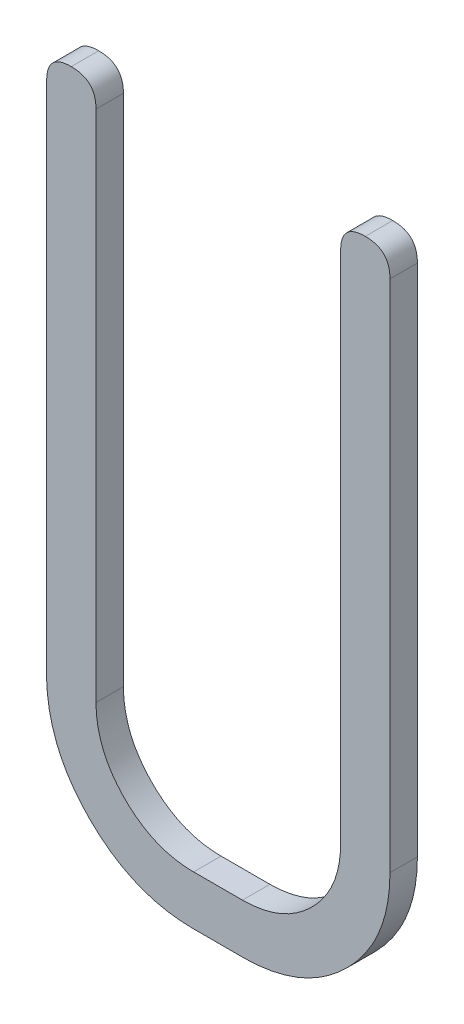
ISO-10303-21;
HEADER;
FILE_DESCRIPTION(('STEP AP214'),'2;1');
FILE_NAME('part.step','',(''),(''),'','','');
FILE_SCHEMA(('AUTOMOTIVE_DESIGN { 1 0 10303 214 1 1 1 1 }'));
ENDSEC;
DATA;
#1=APPLICATION_CONTEXT('core data for automotive mechanical design processes');
#2=APPLICATION_PROTOCOL_DEFINITION('international standard','automotive_design',2000,#1);
#3=PRODUCT_CONTEXT('',#1,'mechanical');
#4=PRODUCT('Part','Part','',(#3));
#5=PRODUCT_RELATED_PRODUCT_CATEGORY('part','',(#4));
#6=PRODUCT_DEFINITION_FORMATION('','',#4);
#7=PRODUCT_DEFINITION_CONTEXT('part definition',#1,'design');
#8=PRODUCT_DEFINITION('design','',#6,#7);
#9=PRODUCT_DEFINITION_SHAPE('','',#8);
#10=(LENGTH_UNIT() NAMED_UNIT(*) SI_UNIT(.MILLI.,.METRE.));
#11=(NAMED_UNIT(*) PLANE_ANGLE_UNIT() SI_UNIT($,.RADIAN.));
#12=(NAMED_UNIT(*) SI_UNIT($,.STERADIAN.) SOLID_ANGLE_UNIT());
#13=UNCERTAINTY_MEASURE_WITH_UNIT(LENGTH_MEASURE(1.E-05),#10,'distance_accuracy_value','');
#14=(GEOMETRIC_REPRESENTATION_CONTEXT(3) GLOBAL_UNCERTAINTY_ASSIGNED_CONTEXT((#13)) GLOBAL_UNIT_ASSIGNED_CONTEXT((#10,
#11,#12)) REPRESENTATION_CONTEXT('',''));
#15=CARTESIAN_POINT('',(0.,0.,0.));
#16=DIRECTION('',(0.,0.,1.));
#17=DIRECTION('',(1.,0.,0.));
#18=AXIS2_PLACEMENT_3D('',#15,#16,#17);
#19=CARTESIAN_POINT('',(0.,0.,1.6));
#20=DIRECTION('',(0.,0.,-1.));
#21=DIRECTION('',(-1.,0.,0.));
#22=AXIS2_PLACEMENT_3D('',#19,#20,#21);
#23=PLANE('',#22);
#24=CARTESIAN_POINT('',(-13.3429437525272,-19.6625547798276,1.6));
#25=CARTESIAN_POINT('',(-13.3429437525272,-19.5733047798276,1.6));
#26=CARTESIAN_POINT('',(-13.2529437525272,-19.5733047798276,1.6));
#27=B_SPLINE_CURVE_WITH_KNOTS('',2,(#24,#25,#26),.UNSPECIFIED.,.F.,.F.,(3,3),(0.,1.),.UNSPECIFIED.);
#28=CARTESIAN_POINT('',(-13.3429437525272,-19.6625547798276,1.6));
#29=VERTEX_POINT('',#28);
#30=CARTESIAN_POINT('',(-13.2529437525272,-19.5733047798276,1.6));
#31=VERTEX_POINT('',#30);
#32=EDGE_CURVE('E175',#29,#31,#27,.T.);
#33=ORIENTED_EDGE('',*,*,#32,.T.);
#34=CARTESIAN_POINT('',(-13.2529437525272,-19.5733047798276,1.6));
#35=CARTESIAN_POINT('',(-13.1629437525272,-19.5733047798276,1.6));
#36=CARTESIAN_POINT('',(-13.1629437525272,-19.6626172798276,1.6));
#37=B_SPLINE_CURVE_WITH_KNOTS('',2,(#34,#35,#36),.UNSPECIFIED.,.F.,.F.,(3,3),(0.,1.),.UNSPECIFIED.);
#38=CARTESIAN_POINT('',(-13.1629437525272,-19.6626172798276,1.6));
#39=VERTEX_POINT('',#38);
#40=EDGE_CURVE('E137',#31,#39,#37,.T.);
#41=ORIENTED_EDGE('',*,*,#40,.T.);
#42=DIRECTION('',(0.,1.,0.));
#43=VECTOR('',#42,1.);
#44=CARTESIAN_POINT('',(-13.1629437525272,-19.6626172798276,1.6));
#45=LINE('',#44,#43);
#46=CARTESIAN_POINT('',(-13.1629437525272,-21.5376172798276,1.6));
#47=VERTEX_POINT('',#46);
#48=EDGE_CURVE('E132',#47,#39,#45,.T.);
#49=ORIENTED_EDGE('',*,*,#48,.F.);
#50=CARTESIAN_POINT('',(-13.1629437525272,-21.5376172798276,1.6));
#51=CARTESIAN_POINT('',(-13.1629398018063,-21.5539345573081,1.6));
#52=CARTESIAN_POINT('',(-13.1635737139581,-21.5702615240957,1.6));
#53=CARTESIAN_POINT('',(-13.1662190725024,-21.6028215898711,1.6));
#54=CARTESIAN_POINT('',(-13.1682321669494,-21.6190545531003,1.6));
#55=CARTESIAN_POINT('',(-13.1737163695039,-21.6511459772082,1.6));
#56=CARTESIAN_POINT('',(-13.1771757946783,-21.6670063866334,1.6));
#57=CARTESIAN_POINT('',(-13.185588337284,-21.6983122727357,1.6));
#58=CARTESIAN_POINT('',(-13.190540767304,-21.7137579368137,1.6));
#59=CARTESIAN_POINT('',(-13.2077514452743,-21.7594768640935,1.6));
#60=CARTESIAN_POINT('',(-13.222329270436,-21.7889255370711,1.6));
#61=CARTESIAN_POINT('',(-13.2481963322795,-21.83055163987,1.6));
#62=CARTESIAN_POINT('',(-13.2575034367635,-21.844021936246,1.6));
#63=CARTESIAN_POINT('',(-13.2773030248523,-21.8700712672825,1.6));
#64=CARTESIAN_POINT('',(-13.2877956968858,-21.8826501597489,1.6));
#65=CARTESIAN_POINT('',(-13.3085736204856,-21.9055470264418,1.6));
#66=CARTESIAN_POINT('',(-13.3187537395851,-21.915961256857,1.6));
#67=CARTESIAN_POINT('',(-13.339820170662,-21.9360415929991,1.6));
#68=CARTESIAN_POINT('',(-13.3507063509913,-21.9457078374581,1.6));
#69=CARTESIAN_POINT('',(-13.3844100604015,-21.9733653645849,1.6));
#70=CARTESIAN_POINT('',(-13.4083196962675,-21.9900680006095,1.6));
#71=CARTESIAN_POINT('',(-13.4610492880886,-22.0205098204532,1.6));
#72=CARTESIAN_POINT('',(-13.4901198346769,-22.0338184607467,1.6));
#73=CARTESIAN_POINT('',(-13.550287979984,-22.0546449723789,1.6));
#74=CARTESIAN_POINT('',(-13.5813868697126,-22.0621591158178,1.6));
#75=CARTESIAN_POINT('',(-13.6273801460908,-22.0690967939304,1.6));
#76=CARTESIAN_POINT('',(-13.641988216102,-22.0706981530884,1.6));
#77=CARTESIAN_POINT('',(-13.6712323131673,-22.0727998214802,1.6));
#78=CARTESIAN_POINT('',(-13.6858680568621,-22.0733040193726,1.6));
#79=CARTESIAN_POINT('',(-13.7005062525272,-22.0733047798276,1.6));
#80=B_SPLINE_CURVE_WITH_KNOTS('',3,(#50,#51,#52,#53,#54,#55,#56,#57,#58,#59,#60,#61,#62,#63,#64,
#65,#66,#67,#68,#69,#70,#71,#72,#73,#74,#75,#76,#77,#78,#79),.UNSPECIFIED.,.F.,.F.,(4,2,2,2,2,2,
2,2,2,2,2,2,2,2,4),(0.,0.0489534661521451,0.0979655315378866,0.14658911902647,0.195190353279846,
0.293010130352061,0.342076568756885,0.391150816559739,0.434803887680262,0.478448842766931,
0.565529470871683,0.660858252620425,0.7562483132609,0.80030220821932,0.844199707301668),.UNSPECIFIED.);
#81=CARTESIAN_POINT('',(-13.7005062525272,-22.0733047798276,1.6));
#82=VERTEX_POINT('',#81);
#83=EDGE_CURVE('E23',#47,#82,#80,.T.);
#84=ORIENTED_EDGE('',*,*,#83,.T.);
#85=DIRECTION('',(1.,0.,0.));
#86=VECTOR('',#85,1.);
#87=CARTESIAN_POINT('',(-13.7005062525272,-22.0733047798276,1.6));
#88=LINE('',#87,#86);
#89=CARTESIAN_POINT('',(-13.8791312525272,-22.0733047798276,1.6));
#90=VERTEX_POINT('',#89);
#91=EDGE_CURVE('E130',#90,#82,#88,.T.);
#92=ORIENTED_EDGE('',*,*,#91,.F.);
#93=CARTESIAN_POINT('',(-13.8791312525272,-22.0733047798276,1.6));
#94=CARTESIAN_POINT('',(-13.8952564736014,-22.0733089573908,1.6));
#95=CARTESIAN_POINT('',(-13.9113907684639,-22.0726801795492,1.6));
#96=CARTESIAN_POINT('',(-13.9435647026714,-22.0700622239027,1.6));
#97=CARTESIAN_POINT('',(-13.9596042208875,-22.0680715767394,1.6));
#98=CARTESIAN_POINT('',(-13.9913067829568,-22.0626577949026,1.6));
#99=CARTESIAN_POINT('',(-14.0069718567041,-22.0592468234264,1.6));
#100=CARTESIAN_POINT('',(-14.0378977029642,-22.0509630462682,1.6));
#101=CARTESIAN_POINT('',(-14.0531586443354,-22.0460908619571,1.6));
#102=CARTESIAN_POINT('',(-14.0983273880169,-22.0291874019806,1.6));
#103=CARTESIAN_POINT('',(-14.127436368046,-22.0148996210445,1.6));
#104=CARTESIAN_POINT('',(-14.168660491291,-21.9895823250857,1.6));
#105=CARTESIAN_POINT('',(-14.1820159394143,-21.9804768038947,1.6));
#106=CARTESIAN_POINT('',(-14.2078733422636,-21.9611135078422,1.6));
#107=CARTESIAN_POINT('',(-14.220375164043,-21.9508555541521,1.6));
#108=CARTESIAN_POINT('',(-14.243361244532,-21.9303662115052,1.6));
#109=CARTESIAN_POINT('',(-14.2539246974858,-21.9202229108959,1.6));
#110=CARTESIAN_POINT('',(-14.2743141870391,-21.8992268726827,1.6));
#111=CARTESIAN_POINT('',(-14.2841403353045,-21.8883742429756,1.6));
#112=CARTESIAN_POINT('',(-14.3122920300438,-21.8547600588256,1.6));
#113=CARTESIAN_POINT('',(-14.329343491761,-21.830895999864,1.6));
#114=CARTESIAN_POINT('',(-14.360592752259,-21.7780336799741,1.6));
#115=CARTESIAN_POINT('',(-14.3743301106466,-21.748760389499,1.6));
#116=CARTESIAN_POINT('',(-14.3958292289554,-21.6880763611869,1.6));
#117=CARTESIAN_POINT('',(-14.4035884796525,-21.656664731827,1.6));
#118=CARTESIAN_POINT('',(-14.4106818449281,-21.6104096655832,1.6));
#119=CARTESIAN_POINT('',(-14.4123029574493,-21.595871606112,1.6));
#120=CARTESIAN_POINT('',(-14.4144316493107,-21.5667622012025,1.6));
#121=CARTESIAN_POINT('',(-14.4149429518961,-21.552191131743,1.6));
#122=CARTESIAN_POINT('',(-14.4149437525272,-21.5376172798276,1.6));
#123=B_SPLINE_CURVE_WITH_KNOTS('',3,(#93,#94,#95,#96,#97,#98,#99,#100,#101,#102,#103,#104,#105,
#106,#107,#108,#109,#110,#111,#112,#113,#114,#115,#116,#117,#118,#119,#120,#121,#122),
.UNSPECIFIED.,.F.,.F.,(4,2,2,2,2,2,2,2,2,2,2,2,2,2,4),(0.,0.0483764248649214,0.0968051268730586,
0.144827363361269,0.192829207603212,0.289385393105351,0.337828594769527,0.386279324014535,
0.430177056629099,0.474068127390591,0.561642140581159,0.658037173700187,0.75447264522963,
0.798323494415397,0.842027001744804),.UNSPECIFIED.);
#124=CARTESIAN_POINT('',(-14.4149437525272,-21.5376172798276,1.6));
#125=VERTEX_POINT('',#124);
#126=EDGE_CURVE('E191',#90,#125,#123,.T.);
#127=ORIENTED_EDGE('',*,*,#126,.T.);
#128=DIRECTION('',(0.,1.,0.));
#129=VECTOR('',#128,1.);
#130=CARTESIAN_POINT('',(-14.4149437525272,-21.5376172798276,1.6));
#131=LINE('',#130,#129);
#132=CARTESIAN_POINT('',(-14.4149437525272,-19.6626172798276,1.6));
#133=VERTEX_POINT('',#132);
#134=EDGE_CURVE('E196',#133,#125,#131,.F.);
#135=ORIENTED_EDGE('',*,*,#134,.F.);
#136=CARTESIAN_POINT('',(-14.4149437525272,-19.6626172798276,1.6));
#137=CARTESIAN_POINT('',(-14.4149437525272,-19.5733047798276,1.6));
#138=CARTESIAN_POINT('',(-14.3249437525272,-19.5733047798276,1.6));
#139=B_SPLINE_CURVE_WITH_KNOTS('',2,(#136,#137,#138),.UNSPECIFIED.,.F.,.F.,(3,3),(0.,1.),.UNSPECIFIED.);
#140=CARTESIAN_POINT('',(-14.3249437525272,-19.5733047798276,1.6));
#141=VERTEX_POINT('',#140);
#142=EDGE_CURVE('E145',#133,#141,#139,.T.);
#143=ORIENTED_EDGE('',*,*,#142,.T.);
#144=CARTESIAN_POINT('',(-14.3249437525272,-19.5733047798276,1.6));
#145=CARTESIAN_POINT('',(-14.2349437525272,-19.5733047798276,1.6));
#146=CARTESIAN_POINT('',(-14.2349437525272,-19.6625547798276,1.6));
#147=B_SPLINE_CURVE_WITH_KNOTS('',2,(#144,#145,#146),.UNSPECIFIED.,.F.,.F.,(3,3),(0.,1.),.UNSPECIFIED.);
#148=CARTESIAN_POINT('',(-14.2349437525272,-19.6625547798276,1.6));
#149=VERTEX_POINT('',#148);
#150=EDGE_CURVE('E150',#141,#149,#147,.T.);
#151=ORIENTED_EDGE('',*,*,#150,.T.);
#152=DIRECTION('',(0.,1.,0.));
#153=VECTOR('',#152,1.);
#154=CARTESIAN_POINT('',(-14.2349437525272,-19.6625547798276,1.6));
#155=LINE('',#154,#153);
#156=CARTESIAN_POINT('',(-14.2349437525272,-21.5363672798276,1.6));
#157=VERTEX_POINT('',#156);
#158=EDGE_CURVE('E341',#157,#149,#155,.T.);
#159=ORIENTED_EDGE('',*,*,#158,.F.);
#160=CARTESIAN_POINT('',(-14.2349437525272,-21.5363672798276,1.6));
#161=CARTESIAN_POINT('',(-14.2349689861197,-21.5532479049684,1.6));
#162=CARTESIAN_POINT('',(-14.2338974573155,-21.5701571975919,1.6));
#163=CARTESIAN_POINT('',(-14.2294118301139,-21.6036149589301,1.6));
#164=CARTESIAN_POINT('',(-14.2260034915446,-21.6201642118341,1.6));
#165=CARTESIAN_POINT('',(-14.2157119883329,-21.6559995848338,1.6));
#166=CARTESIAN_POINT('',(-14.2082460735907,-21.6751236646226,1.6));
#167=CARTESIAN_POINT('',(-14.1899162860523,-21.7116760394207,1.6));
#168=CARTESIAN_POINT('',(-14.1790486271618,-21.7291024164339,1.6));
#169=CARTESIAN_POINT('',(-14.1554784962907,-21.760674872707,1.6));
#170=CARTESIAN_POINT('',(-14.1429684249952,-21.7749676654043,1.6));
#171=CARTESIAN_POINT('',(-14.1161639675921,-21.8017728601216,1.6));
#172=CARTESIAN_POINT('',(-14.1018691667959,-21.8142848469139,1.6));
#173=CARTESIAN_POINT('',(-14.0687725766832,-21.8389680556646,1.6));
#174=CARTESIAN_POINT('',(-14.0496213055378,-21.8506834708767,1.6));
#175=CARTESIAN_POINT('',(-14.0093400959902,-21.8699633820969,1.6));
#176=CARTESIAN_POINT('',(-13.9882126149354,-21.8775329550488,1.6));
#177=CARTESIAN_POINT('',(-13.9522511596251,-21.8864749680743,1.6));
#178=CARTESIAN_POINT('',(-13.9377055635294,-21.8890775164633,1.6));
#179=CARTESIAN_POINT('',(-13.9083960791044,-21.892498057968,1.6));
#180=CARTESIAN_POINT('',(-13.8936320942343,-21.8933152365747,1.6));
#181=CARTESIAN_POINT('',(-13.8788812525272,-21.8933047798276,1.6));
#182=B_SPLINE_CURVE_WITH_KNOTS('',3,(#160,#161,#162,#163,#164,#165,#166,#167,#168,#169,#170,
#171,#172,#173,#174,#175,#176,#177,#178,#179,#180,#181),.UNSPECIFIED.,.F.,.F.,(4,2,2,2,2,2,2,2,
2,2,4),(0.,0.0506464607007709,0.101168533390911,0.162383158978868,0.223666159315868,
0.280465733665371,0.337278530257622,0.404188837973772,0.47101702395649,0.515241436353297,
0.559486020293953),.UNSPECIFIED.);
#183=CARTESIAN_POINT('',(-13.8788812525272,-21.8933047798276,1.6));
#184=VERTEX_POINT('',#183);
#185=EDGE_CURVE('E186',#157,#184,#182,.T.);
#186=ORIENTED_EDGE('',*,*,#185,.T.);
#187=DIRECTION('',(1.,0.,0.));
#188=VECTOR('',#187,1.);
#189=CARTESIAN_POINT('',(-13.8788812525272,-21.8933047798276,1.6));
#190=LINE('',#189,#188);
#191=CARTESIAN_POINT('',(-13.7008187525272,-21.8933047798276,1.6));
#192=VERTEX_POINT('',#191);
#193=EDGE_CURVE('E335',#192,#184,#190,.F.);
#194=ORIENTED_EDGE('',*,*,#193,.F.);
#195=CARTESIAN_POINT('',(-13.7008187525272,-21.8933047798276,1.6));
#196=CARTESIAN_POINT('',(-13.6903964009985,-21.8933048431522,1.6));
#197=CARTESIAN_POINT('',(-13.6799746244956,-21.8929146520043,1.6));
#198=CARTESIAN_POINT('',(-13.6591873169744,-21.8912892602704,1.6));
#199=CARTESIAN_POINT('',(-13.6488218548898,-21.890053190341,1.6));
#200=CARTESIAN_POINT('',(-13.618098224631,-21.8850087505753,1.6));
#201=CARTESIAN_POINT('',(-13.5979352016053,-21.8798661841505,1.6));
#202=CARTESIAN_POINT('',(-13.5591914436146,-21.8659868488786,1.6));
#203=CARTESIAN_POINT('',(-13.540593464365,-21.8572979634533,1.6));
#204=CARTESIAN_POINT('',(-13.505233762612,-21.8366976589984,1.6));
#205=CARTESIAN_POINT('',(-13.4884758826451,-21.8247796702031,1.6));
#206=CARTESIAN_POINT('',(-13.46537711195,-21.8053840365207,1.6));
#207=CARTESIAN_POINT('',(-13.4581957193018,-21.7988708087916,1.6));
#208=CARTESIAN_POINT('',(-13.4443007754446,-21.7853628817361,1.6));
#209=CARTESIAN_POINT('',(-13.4375872141807,-21.7783681927641,1.6));
#210=CARTESIAN_POINT('',(-13.4182719556757,-21.7566756180218,1.6));
#211=CARTESIAN_POINT('',(-13.4064675495854,-21.7412457851152,1.6));
#212=CARTESIAN_POINT('',(-13.3844211134981,-21.7066897881273,1.6));
#213=CARTESIAN_POINT('',(-13.3745210765312,-21.6873424246006,1.6));
#214=CARTESIAN_POINT('',(-13.3587450584436,-21.6470588574096,1.6));
#215=CARTESIAN_POINT('',(-13.352870161895,-21.6261222272048,1.6));
#216=CARTESIAN_POINT('',(-13.3469062803011,-21.593548823108,1.6));
#217=CARTESIAN_POINT('',(-13.3453962006727,-21.582146468142,1.6));
#218=CARTESIAN_POINT('',(-13.3434161259191,-21.5592846101237,1.6));
#219=CARTESIAN_POINT('',(-13.3429430501745,-21.5478253779726,1.6));
#220=CARTESIAN_POINT('',(-13.3429437525272,-21.5363672798276,1.6));
#221=B_SPLINE_CURVE_WITH_KNOTS('',3,(#195,#196,#197,#198,#199,#200,#201,#202,#203,#204,#205,
#206,#207,#208,#209,#210,#211,#212,#213,#214,#215,#216,#217,#218,#219,#220),.UNSPECIFIED.,.F.,
.F.,(4,2,2,2,2,2,2,2,2,2,2,2,4),(0.,0.0312555724291086,0.0625433157964686,0.124592763921181,
0.185830747858814,0.247194271333192,0.276260761886681,0.305326627538444,0.363349527399501,
0.428128917739467,0.492925755997,0.527390582265405,0.56175288459469),.UNSPECIFIED.);
#222=CARTESIAN_POINT('',(-13.3429437525272,-21.5363672798276,1.6));
#223=VERTEX_POINT('',#222);
#224=EDGE_CURVE('E179',#192,#223,#221,.T.);
#225=ORIENTED_EDGE('',*,*,#224,.T.);
#226=DIRECTION('',(0.,1.,0.));
#227=VECTOR('',#226,1.);
#228=CARTESIAN_POINT('',(-13.3429437525272,-21.5363672798276,1.6));
#229=LINE('',#228,#227);
#230=EDGE_CURVE('E329',#29,#223,#229,.F.);
#231=ORIENTED_EDGE('',*,*,#230,.F.);
#232=EDGE_LOOP('',(#33,#41,#49,#84,#92,#127,#135,#143,#151,#159,#186,#194,#225,#231));
#233=FACE_BOUND('',#232,.T.);
#234=ADVANCED_FACE('F17',(#233),#23,.T.);
#235=CARTESIAN_POINT('',(-13.1629437525272,-21.5376172798276,1.7));
#236=CARTESIAN_POINT('',(-13.1629437525272,-21.7608047798276,1.7));
#237=CARTESIAN_POINT('',(-13.4772562525272,-22.0733047798276,1.7));
#238=CARTESIAN_POINT('',(-13.7005062525272,-22.0733047798276,1.7));
#239=CARTESIAN_POINT('',(-13.1629437525272,-21.5376172798276,1.6));
#240=CARTESIAN_POINT('',(-13.1629437525272,-21.7608047798276,1.6));
#241=CARTESIAN_POINT('',(-13.4772562525272,-22.0733047798276,1.6));
#242=CARTESIAN_POINT('',(-13.7005062525272,-22.0733047798276,1.6));
#243=B_SPLINE_SURFACE_WITH_KNOTS('',1,2,((#235,#236,#237,#238),(#239,#240,#241,#242)),
.UNSPECIFIED.,.F.,.F.,.F.,(2,2),(3,1,3),(0.,1.),(0.,0.5,1.),.UNSPECIFIED.);
#244=DIRECTION('',(0.,0.,-1.));
#245=VECTOR('',#244,1.);
#246=CARTESIAN_POINT('',(-13.1629437525272,-21.5376172798276,1.7));
#247=LINE('',#246,#245);
#248=CARTESIAN_POINT('',(-13.1629437525272,-21.5376172798276,1.7));
#249=VERTEX_POINT('',#248);
#250=EDGE_CURVE('E126',#249,#47,#247,.T.);
#251=CARTESIAN_POINT('',(-13.1629437525272,-21.5376172798276,1.7));
#252=CARTESIAN_POINT('',(-13.1629398018063,-21.5539345573081,1.7));
#253=CARTESIAN_POINT('',(-13.1635737139581,-21.5702615240957,1.7));
#254=CARTESIAN_POINT('',(-13.1662190725024,-21.6028215898711,1.7));
#255=CARTESIAN_POINT('',(-13.1682321669494,-21.6190545531003,1.7));
#256=CARTESIAN_POINT('',(-13.1737163695039,-21.6511459772082,1.7));
#257=CARTESIAN_POINT('',(-13.1771757946783,-21.6670063866334,1.7));
#258=CARTESIAN_POINT('',(-13.185588337284,-21.6983122727357,1.7));
#259=CARTESIAN_POINT('',(-13.190540767304,-21.7137579368137,1.7));
#260=CARTESIAN_POINT('',(-13.2077514452743,-21.7594768640935,1.7));
#261=CARTESIAN_POINT('',(-13.2223292704361,-21.7889255370711,1.7));
#262=CARTESIAN_POINT('',(-13.2481963322795,-21.83055163987,1.7));
#263=CARTESIAN_POINT('',(-13.2575034367635,-21.844021936246,1.7));
#264=CARTESIAN_POINT('',(-13.2773030248523,-21.8700712672825,1.7));
#265=CARTESIAN_POINT('',(-13.2877956968858,-21.8826501597489,1.7));
#266=CARTESIAN_POINT('',(-13.3085736204856,-21.9055470264418,1.7));
#267=CARTESIAN_POINT('',(-13.3187537395851,-21.915961256857,1.7));
#268=CARTESIAN_POINT('',(-13.339820170662,-21.936041592999,1.7));
#269=CARTESIAN_POINT('',(-13.3507063509913,-21.9457078374581,1.7));
#270=CARTESIAN_POINT('',(-13.3844100604015,-21.9733653645849,1.7));
#271=CARTESIAN_POINT('',(-13.4083196962675,-21.9900680006095,1.7));
#272=CARTESIAN_POINT('',(-13.4610492880886,-22.0205098204532,1.7));
#273=CARTESIAN_POINT('',(-13.4901198346769,-22.0338184607467,1.7));
#274=CARTESIAN_POINT('',(-13.550287979984,-22.0546449723789,1.7));
#275=CARTESIAN_POINT('',(-13.5813868697126,-22.0621591158178,1.7));
#276=CARTESIAN_POINT('',(-13.6273801460908,-22.0690967939304,1.7));
#277=CARTESIAN_POINT('',(-13.641988216102,-22.0706981530884,1.7));
#278=CARTESIAN_POINT('',(-13.6712323131673,-22.0727998214802,1.7));
#279=CARTESIAN_POINT('',(-13.6858680568621,-22.0733040193726,1.7));
#280=CARTESIAN_POINT('',(-13.7005062525272,-22.0733047798276,1.7));
#281=B_SPLINE_CURVE_WITH_KNOTS('',3,(#251,#252,#253,#254,#255,#256,#257,#258,#259,#260,#261,
#262,#263,#264,#265,#266,#267,#268,#269,#270,#271,#272,#273,#274,#275,#276,#277,#278,#279,#280),
.UNSPECIFIED.,.F.,.F.,(4,2,2,2,2,2,2,2,2,2,2,2,2,2,4),(0.,0.0489534661521485,0.0979655315378901,
0.146589119026471,0.195190353279846,0.293010130352057,0.342076568756878,0.39115081655973,
0.434803887680252,0.478448842766921,0.565529470871673,0.660858252620425,0.756248313260913,
0.800302208219326,0.844199707301667),.UNSPECIFIED.);
#282=CARTESIAN_POINT('',(-13.7005062525272,-22.0733047798276,1.7));
#283=VERTEX_POINT('',#282);
#284=EDGE_CURVE('E134',#249,#283,#281,.T.);
#285=DIRECTION('',(0.,0.,-1.));
#286=VECTOR('',#285,1.);
#287=CARTESIAN_POINT('',(-13.7005062525272,-22.0733047798276,1.7));
#288=LINE('',#287,#286);
#289=EDGE_CURVE('E127',#82,#283,#288,.F.);
#290=ORIENTED_EDGE('',*,*,#250,.F.);
#291=ORIENTED_EDGE('',*,*,#284,.T.);
#292=ORIENTED_EDGE('',*,*,#289,.F.);
#293=ORIENTED_EDGE('',*,*,#83,.F.);
#294=EDGE_LOOP('',(#290,#291,#292,#293));
#295=FACE_BOUND('',#294,.T.);
#296=ADVANCED_FACE('F124',(#295),#243,.F.);
#297=CARTESIAN_POINT('',(-13.7005062525272,-22.0733047798276,1.7));
#298=DIRECTION('',(0.,-1.,0.));
#299=DIRECTION('',(0.,0.,-1.));
#300=AXIS2_PLACEMENT_3D('',#297,#298,#299);
#301=PLANE('',#300);
#302=DIRECTION('',(-1.,0.,0.));
#303=VECTOR('',#302,1.);
#304=CARTESIAN_POINT('',(0.,-22.0733047798276,1.7));
#305=LINE('',#304,#303);
#306=CARTESIAN_POINT('',(-13.8791312525272,-22.0733047798276,1.7));
#307=VERTEX_POINT('',#306);
#308=EDGE_CURVE('E225',#283,#307,#305,.T.);
#309=ORIENTED_EDGE('',*,*,#308,.T.);
#310=DIRECTION('',(0.,0.,-1.));
#311=VECTOR('',#310,1.);
#312=CARTESIAN_POINT('',(-13.8791312525272,-22.0733047798276,1.65));
#313=LINE('',#312,#311);
#314=EDGE_CURVE('E197',#307,#90,#313,.T.);
#315=ORIENTED_EDGE('',*,*,#314,.T.);
#316=ORIENTED_EDGE('',*,*,#91,.T.);
#317=ORIENTED_EDGE('',*,*,#289,.T.);
#318=EDGE_LOOP('',(#309,#315,#316,#317));
#319=FACE_BOUND('',#318,.T.);
#320=ADVANCED_FACE('F161',(#319),#301,.T.);
#321=CARTESIAN_POINT('',(-13.8791312525272,-22.0733047798276,1.7));
#322=CARTESIAN_POINT('',(-14.1006312525272,-22.0733047798276,1.7));
#323=CARTESIAN_POINT('',(-14.4149437525272,-21.7589922798276,1.7));
#324=CARTESIAN_POINT('',(-14.4149437525272,-21.5376172798276,1.7));
#325=CARTESIAN_POINT('',(-13.8791312525272,-22.0733047798276,1.6));
#326=CARTESIAN_POINT('',(-14.1006312525272,-22.0733047798276,1.6));
#327=CARTESIAN_POINT('',(-14.4149437525272,-21.7589922798276,1.6));
#328=CARTESIAN_POINT('',(-14.4149437525272,-21.5376172798276,1.6));
#329=B_SPLINE_SURFACE_WITH_KNOTS('',1,2,((#321,#322,#323,#324),(#325,#326,#327,#328)),
.UNSPECIFIED.,.F.,.F.,.F.,(2,2),(3,1,3),(0.,1.),(0.,0.5,1.),.UNSPECIFIED.);
#330=CARTESIAN_POINT('',(-13.8791312525272,-22.0733047798276,1.7));
#331=CARTESIAN_POINT('',(-13.8952564736014,-22.0733089573908,1.7));
#332=CARTESIAN_POINT('',(-13.9113907684639,-22.0726801795492,1.7));
#333=CARTESIAN_POINT('',(-13.9435647026714,-22.0700622239027,1.7));
#334=CARTESIAN_POINT('',(-13.9596042208875,-22.0680715767394,1.7));
#335=CARTESIAN_POINT('',(-13.9913067829568,-22.0626577949026,1.7));
#336=CARTESIAN_POINT('',(-14.0069718567041,-22.0592468234264,1.7));
#337=CARTESIAN_POINT('',(-14.0378977029642,-22.0509630462682,1.7));
#338=CARTESIAN_POINT('',(-14.0531586443354,-22.0460908619571,1.7));
#339=CARTESIAN_POINT('',(-14.0983273880169,-22.0291874019806,1.7));
#340=CARTESIAN_POINT('',(-14.127436368046,-22.0148996210445,1.7));
#341=CARTESIAN_POINT('',(-14.168660491291,-21.9895823250857,1.7));
#342=CARTESIAN_POINT('',(-14.1820159394143,-21.9804768038947,1.7));
#343=CARTESIAN_POINT('',(-14.2078733422636,-21.9611135078422,1.7));
#344=CARTESIAN_POINT('',(-14.220375164043,-21.9508555541521,1.7));
#345=CARTESIAN_POINT('',(-14.243361244532,-21.9303662115052,1.7));
#346=CARTESIAN_POINT('',(-14.2539246974858,-21.9202229108959,1.7));
#347=CARTESIAN_POINT('',(-14.2743141870391,-21.8992268726827,1.7));
#348=CARTESIAN_POINT('',(-14.2841403353045,-21.8883742429756,1.7));
#349=CARTESIAN_POINT('',(-14.3122920300438,-21.8547600588256,1.7));
#350=CARTESIAN_POINT('',(-14.329343491761,-21.830895999864,1.7));
#351=CARTESIAN_POINT('',(-14.360592752259,-21.7780336799741,1.7));
#352=CARTESIAN_POINT('',(-14.3743301106466,-21.748760389499,1.7));
#353=CARTESIAN_POINT('',(-14.3958292289554,-21.6880763611869,1.7));
#354=CARTESIAN_POINT('',(-14.4035884796525,-21.656664731827,1.7));
#355=CARTESIAN_POINT('',(-14.4106818449281,-21.6104096655832,1.7));
#356=CARTESIAN_POINT('',(-14.4123029574493,-21.595871606112,1.7));
#357=CARTESIAN_POINT('',(-14.4144316493107,-21.5667622012025,1.7));
#358=CARTESIAN_POINT('',(-14.4149429518961,-21.552191131743,1.7));
#359=CARTESIAN_POINT('',(-14.4149437525272,-21.5376172798276,1.7));
#360=B_SPLINE_CURVE_WITH_KNOTS('',3,(#330,#331,#332,#333,#334,#335,#336,#337,#338,#339,#340,
#341,#342,#343,#344,#345,#346,#347,#348,#349,#350,#351,#352,#353,#354,#355,#356,#357,#358,#359),
.UNSPECIFIED.,.F.,.F.,(4,2,2,2,2,2,2,2,2,2,2,2,2,2,4),(0.,0.0483764248649214,0.0968051268730586,
0.144827363361271,0.192829207603212,0.289385393105352,0.337828594769531,0.386279324014535,
0.430177056629102,0.474068127390592,0.561642140581159,0.658037173700188,0.754472645229627,
0.798323494415395,0.842027001744805),.UNSPECIFIED.);
#361=CARTESIAN_POINT('',(-14.4149437525272,-21.5376172798276,1.7));
#362=VERTEX_POINT('',#361);
#363=EDGE_CURVE('E217',#307,#362,#360,.T.);
#364=DIRECTION('',(0.,0.,1.));
#365=VECTOR('',#364,1.);
#366=CARTESIAN_POINT('',(-14.4149437525272,-21.5376172798276,1.7));
#367=LINE('',#366,#365);
#368=EDGE_CURVE('E346',#125,#362,#367,.T.);
#369=ORIENTED_EDGE('',*,*,#314,.F.);
#370=ORIENTED_EDGE('',*,*,#363,.T.);
#371=ORIENTED_EDGE('',*,*,#368,.F.);
#372=ORIENTED_EDGE('',*,*,#126,.F.);
#373=EDGE_LOOP('',(#369,#370,#371,#372));
#374=FACE_BOUND('',#373,.T.);
#375=ADVANCED_FACE('F198',(#374),#329,.F.);
#376=CARTESIAN_POINT('',(-14.4149437525272,-21.5376172798276,1.7));
#377=DIRECTION('',(-1.,0.,0.));
#378=DIRECTION('',(0.,0.,1.));
#379=AXIS2_PLACEMENT_3D('',#376,#377,#378);
#380=PLANE('',#379);
#381=DIRECTION('',(0.,1.,0.));
#382=VECTOR('',#381,1.);
#383=CARTESIAN_POINT('',(-14.4149437525272,0.,1.7));
#384=LINE('',#383,#382);
#385=CARTESIAN_POINT('',(-14.4149437525272,-19.6626172798276,1.7));
#386=VERTEX_POINT('',#385);
#387=EDGE_CURVE('E224',#362,#386,#384,.T.);
#388=ORIENTED_EDGE('',*,*,#387,.T.);
#389=DIRECTION('',(0.,0.,-1.));
#390=VECTOR('',#389,1.);
#391=CARTESIAN_POINT('',(-14.4149437525272,-19.6626172798276,1.65));
#392=LINE('',#391,#390);
#393=EDGE_CURVE('E149',#386,#133,#392,.T.);
#394=ORIENTED_EDGE('',*,*,#393,.T.);
#395=ORIENTED_EDGE('',*,*,#134,.T.);
#396=ORIENTED_EDGE('',*,*,#368,.T.);
#397=EDGE_LOOP('',(#388,#394,#395,#396));
#398=FACE_BOUND('',#397,.T.);
#399=ADVANCED_FACE('F204',(#398),#380,.T.);
#400=CARTESIAN_POINT('',(-14.4149437525272,-19.6626172798276,1.7));
#401=CARTESIAN_POINT('',(-14.4149437525272,-19.5733047798276,1.7));
#402=CARTESIAN_POINT('',(-14.3249437525272,-19.5733047798276,1.7));
#403=CARTESIAN_POINT('',(-14.4149437525272,-19.6626172798276,1.6));
#404=CARTESIAN_POINT('',(-14.4149437525272,-19.5733047798276,1.6));
#405=CARTESIAN_POINT('',(-14.3249437525272,-19.5733047798276,1.6));
#406=B_SPLINE_SURFACE_WITH_KNOTS('',1,2,((#400,#401,#402),(#403,#404,#405)),.UNSPECIFIED.,.F.,
.F.,.F.,(2,2),(3,3),(0.,1.),(0.,1.),.UNSPECIFIED.);
#407=CARTESIAN_POINT('',(-14.4149437525272,-19.6626172798276,1.7));
#408=CARTESIAN_POINT('',(-14.4149437525272,-19.5733047798276,1.7));
#409=CARTESIAN_POINT('',(-14.3249437525272,-19.5733047798276,1.7));
#410=B_SPLINE_CURVE_WITH_KNOTS('',2,(#407,#408,#409),.UNSPECIFIED.,.F.,.F.,(3,3),(0.,1.),.UNSPECIFIED.);
#411=CARTESIAN_POINT('',(-14.3249437525272,-19.5733047798276,1.7));
#412=VERTEX_POINT('',#411);
#413=EDGE_CURVE('E245',#386,#412,#410,.T.);
#414=DIRECTION('',(0.,0.,-1.));
#415=VECTOR('',#414,1.);
#416=CARTESIAN_POINT('',(-14.3249437525272,-19.5733047798276,1.65));
#417=LINE('',#416,#415);
#418=EDGE_CURVE('E148',#412,#141,#417,.T.);
#419=ORIENTED_EDGE('',*,*,#393,.F.);
#420=ORIENTED_EDGE('',*,*,#413,.T.);
#421=ORIENTED_EDGE('',*,*,#418,.T.);
#422=ORIENTED_EDGE('',*,*,#142,.F.);
#423=EDGE_LOOP('',(#419,#420,#421,#422));
#424=FACE_BOUND('',#423,.T.);
#425=ADVANCED_FACE('F206',(#424),#406,.F.);
#426=CARTESIAN_POINT('',(-14.3249437525272,-19.5733047798276,1.7));
#427=CARTESIAN_POINT('',(-14.2349437525272,-19.5733047798276,1.7));
#428=CARTESIAN_POINT('',(-14.2349437525272,-19.6625547798276,1.7));
#429=CARTESIAN_POINT('',(-14.3249437525272,-19.5733047798276,1.6));
#430=CARTESIAN_POINT('',(-14.2349437525272,-19.5733047798276,1.6));
#431=CARTESIAN_POINT('',(-14.2349437525272,-19.6625547798276,1.6));
#432=B_SPLINE_SURFACE_WITH_KNOTS('',1,2,((#426,#427,#428),(#429,#430,#431)),.UNSPECIFIED.,.F.,
.F.,.F.,(2,2),(3,3),(0.,1.),(0.,1.),.UNSPECIFIED.);
#433=CARTESIAN_POINT('',(-14.3249437525272,-19.5733047798276,1.7));
#434=CARTESIAN_POINT('',(-14.2349437525272,-19.5733047798276,1.7));
#435=CARTESIAN_POINT('',(-14.2349437525272,-19.6625547798276,1.7));
#436=B_SPLINE_CURVE_WITH_KNOTS('',2,(#433,#434,#435),.UNSPECIFIED.,.F.,.F.,(3,3),(0.,1.),.UNSPECIFIED.);
#437=CARTESIAN_POINT('',(-14.2349437525272,-19.6625547798276,1.7));
#438=VERTEX_POINT('',#437);
#439=EDGE_CURVE('E249',#412,#438,#436,.T.);
#440=DIRECTION('',(0.,0.,-1.));
#441=VECTOR('',#440,1.);
#442=CARTESIAN_POINT('',(-14.2349437525272,-19.6625547798276,1.7));
#443=LINE('',#442,#441);
#444=EDGE_CURVE('E339',#149,#438,#443,.F.);
#445=ORIENTED_EDGE('',*,*,#418,.F.);
#446=ORIENTED_EDGE('',*,*,#439,.T.);
#447=ORIENTED_EDGE('',*,*,#444,.F.);
#448=ORIENTED_EDGE('',*,*,#150,.F.);
#449=EDGE_LOOP('',(#445,#446,#447,#448));
#450=FACE_BOUND('',#449,.T.);
#451=ADVANCED_FACE('F364',(#450),#432,.F.);
#452=CARTESIAN_POINT('',(-14.2349437525272,-19.6625547798276,1.7));
#453=DIRECTION('',(1.,0.,0.));
#454=DIRECTION('',(0.,0.,-1.));
#455=AXIS2_PLACEMENT_3D('',#452,#453,#454);
#456=PLANE('',#455);
#457=DIRECTION('',(0.,1.,0.));
#458=VECTOR('',#457,1.);
#459=CARTESIAN_POINT('',(-14.2349437525272,0.,1.7));
#460=LINE('',#459,#458);
#461=CARTESIAN_POINT('',(-14.2349437525272,-21.5363672798276,1.7));
#462=VERTEX_POINT('',#461);
#463=EDGE_CURVE('E320',#438,#462,#460,.F.);
#464=ORIENTED_EDGE('',*,*,#463,.T.);
#465=DIRECTION('',(0.,0.,-1.));
#466=VECTOR('',#465,1.);
#467=CARTESIAN_POINT('',(-14.2349437525272,-21.5363672798276,1.65));
#468=LINE('',#467,#466);
#469=EDGE_CURVE('E336',#462,#157,#468,.T.);
#470=ORIENTED_EDGE('',*,*,#469,.T.);
#471=ORIENTED_EDGE('',*,*,#158,.T.);
#472=ORIENTED_EDGE('',*,*,#444,.T.);
#473=EDGE_LOOP('',(#464,#470,#471,#472));
#474=FACE_BOUND('',#473,.T.);
#475=ADVANCED_FACE('F381',(#474),#456,.T.);
#476=CARTESIAN_POINT('',(-14.2349437525272,-21.5363672798276,1.7));
#477=CARTESIAN_POINT('',(-14.2349437525272,-21.6827422798276,1.7));
#478=CARTESIAN_POINT('',(-14.0248812525272,-21.8933047798276,1.7));
#479=CARTESIAN_POINT('',(-13.8788812525272,-21.8933047798276,1.7));
#480=CARTESIAN_POINT('',(-14.2349437525272,-21.5363672798276,1.6));
#481=CARTESIAN_POINT('',(-14.2349437525272,-21.6827422798276,1.6));
#482=CARTESIAN_POINT('',(-14.0248812525272,-21.8933047798276,1.6));
#483=CARTESIAN_POINT('',(-13.8788812525272,-21.8933047798276,1.6));
#484=B_SPLINE_SURFACE_WITH_KNOTS('',1,2,((#476,#477,#478,#479),(#480,#481,#482,#483)),
.UNSPECIFIED.,.F.,.F.,.F.,(2,2),(3,1,3),(0.,1.),(0.,0.5,1.),.UNSPECIFIED.);
#485=CARTESIAN_POINT('',(-14.2349437525272,-21.5363672798276,1.7));
#486=CARTESIAN_POINT('',(-14.2349689861197,-21.5532479049684,1.7));
#487=CARTESIAN_POINT('',(-14.2338974573156,-21.5701571975919,1.7));
#488=CARTESIAN_POINT('',(-14.2294118301139,-21.6036149589301,1.7));
#489=CARTESIAN_POINT('',(-14.2260034915446,-21.6201642118341,1.7));
#490=CARTESIAN_POINT('',(-14.2157119883329,-21.6559995848338,1.7));
#491=CARTESIAN_POINT('',(-14.2082460735907,-21.6751236646226,1.7));
#492=CARTESIAN_POINT('',(-14.1899162860523,-21.7116760394207,1.7));
#493=CARTESIAN_POINT('',(-14.1790486271618,-21.7291024164339,1.7));
#494=CARTESIAN_POINT('',(-14.1554784962907,-21.760674872707,1.7));
#495=CARTESIAN_POINT('',(-14.1429684249952,-21.7749676654043,1.7));
#496=CARTESIAN_POINT('',(-14.1161639675921,-21.8017728601215,1.7));
#497=CARTESIAN_POINT('',(-14.1018691667959,-21.8142848469139,1.7));
#498=CARTESIAN_POINT('',(-14.0687725766832,-21.8389680556646,1.7));
#499=CARTESIAN_POINT('',(-14.0496213055378,-21.8506834708767,1.7));
#500=CARTESIAN_POINT('',(-14.0093400959902,-21.8699633820969,1.7));
#501=CARTESIAN_POINT('',(-13.9882126149354,-21.8775329550488,1.7));
#502=CARTESIAN_POINT('',(-13.9522511596252,-21.8864749680743,1.7));
#503=CARTESIAN_POINT('',(-13.9377055635294,-21.8890775164633,1.7));
#504=CARTESIAN_POINT('',(-13.9083960791044,-21.892498057968,1.7));
#505=CARTESIAN_POINT('',(-13.8936320942343,-21.8933152365747,1.7));
#506=CARTESIAN_POINT('',(-13.8788812525272,-21.8933047798276,1.7));
#507=B_SPLINE_CURVE_WITH_KNOTS('',3,(#485,#486,#487,#488,#489,#490,#491,#492,#493,#494,#495,
#496,#497,#498,#499,#500,#501,#502,#503,#504,#505,#506),.UNSPECIFIED.,.F.,.F.,(4,2,2,2,2,2,2,2,
2,2,4),(0.,0.0506464607007708,0.101168533390911,0.162383158978867,0.223666159315869,
0.28046573366537,0.337278530257621,0.404188837973769,0.471017023956484,0.515241436353296,
0.559486020293954),.UNSPECIFIED.);
#508=CARTESIAN_POINT('',(-13.8788812525272,-21.8933047798276,1.7));
#509=VERTEX_POINT('',#508);
#510=EDGE_CURVE('E226',#462,#509,#507,.T.);
#511=DIRECTION('',(0.,0.,1.));
#512=VECTOR('',#511,1.);
#513=CARTESIAN_POINT('',(-13.8788812525272,-21.8933047798276,1.7));
#514=LINE('',#513,#512);
#515=EDGE_CURVE('E333',#184,#509,#514,.T.);
#516=ORIENTED_EDGE('',*,*,#469,.F.);
#517=ORIENTED_EDGE('',*,*,#510,.T.);
#518=ORIENTED_EDGE('',*,*,#515,.F.);
#519=ORIENTED_EDGE('',*,*,#185,.F.);
#520=EDGE_LOOP('',(#516,#517,#518,#519));
#521=FACE_BOUND('',#520,.T.);
#522=ADVANCED_FACE('F275',(#521),#484,.F.);
#523=CARTESIAN_POINT('',(-13.8788812525272,-21.8933047798276,1.7));
#524=DIRECTION('',(0.,1.,0.));
#525=DIRECTION('',(0.,0.,1.));
#526=AXIS2_PLACEMENT_3D('',#523,#524,#525);
#527=PLANE('',#526);
#528=DIRECTION('',(-1.,0.,0.));
#529=VECTOR('',#528,1.);
#530=CARTESIAN_POINT('',(0.,-21.8933047798276,1.7));
#531=LINE('',#530,#529);
#532=CARTESIAN_POINT('',(-13.7008187525272,-21.8933047798276,1.7));
#533=VERTEX_POINT('',#532);
#534=EDGE_CURVE('E265',#509,#533,#531,.F.);
#535=ORIENTED_EDGE('',*,*,#534,.T.);
#536=DIRECTION('',(0.,0.,-1.));
#537=VECTOR('',#536,1.);
#538=CARTESIAN_POINT('',(-13.7008187525272,-21.8933047798276,1.65));
#539=LINE('',#538,#537);
#540=EDGE_CURVE('E330',#533,#192,#539,.T.);
#541=ORIENTED_EDGE('',*,*,#540,.T.);
#542=ORIENTED_EDGE('',*,*,#193,.T.);
#543=ORIENTED_EDGE('',*,*,#515,.T.);
#544=EDGE_LOOP('',(#535,#541,#542,#543));
#545=FACE_BOUND('',#544,.T.);
#546=ADVANCED_FACE('F273',(#545),#527,.T.);
#547=CARTESIAN_POINT('',(-13.7008187525272,-21.8933047798276,1.7));
#548=CARTESIAN_POINT('',(-13.5530062525272,-21.8933047798276,1.7));
#549=CARTESIAN_POINT('',(-13.3429437525272,-21.6844922798276,1.7));
#550=CARTESIAN_POINT('',(-13.3429437525272,-21.5363672798276,1.7));
#551=CARTESIAN_POINT('',(-13.7008187525272,-21.8933047798276,1.6));
#552=CARTESIAN_POINT('',(-13.5530062525272,-21.8933047798276,1.6));
#553=CARTESIAN_POINT('',(-13.3429437525272,-21.6844922798276,1.6));
#554=CARTESIAN_POINT('',(-13.3429437525272,-21.5363672798276,1.6));
#555=B_SPLINE_SURFACE_WITH_KNOTS('',1,2,((#547,#548,#549,#550),(#551,#552,#553,#554)),
.UNSPECIFIED.,.F.,.F.,.F.,(2,2),(3,1,3),(0.,1.),(0.,0.5,1.),.UNSPECIFIED.);
#556=CARTESIAN_POINT('',(-13.7008187525272,-21.8933047798276,1.7));
#557=CARTESIAN_POINT('',(-13.6903964009985,-21.8933048431522,1.7));
#558=CARTESIAN_POINT('',(-13.6799746244957,-21.8929146520043,1.7));
#559=CARTESIAN_POINT('',(-13.6591873169744,-21.8912892602704,1.7));
#560=CARTESIAN_POINT('',(-13.6488218548898,-21.890053190341,1.7));
#561=CARTESIAN_POINT('',(-13.618098224631,-21.8850087505753,1.7));
#562=CARTESIAN_POINT('',(-13.5979352016053,-21.8798661841505,1.7));
#563=CARTESIAN_POINT('',(-13.5591914436146,-21.8659868488786,1.7));
#564=CARTESIAN_POINT('',(-13.540593464365,-21.8572979634533,1.7));
#565=CARTESIAN_POINT('',(-13.505233762612,-21.8366976589984,1.7));
#566=CARTESIAN_POINT('',(-13.4884758826451,-21.8247796702031,1.7));
#567=CARTESIAN_POINT('',(-13.46537711195,-21.8053840365207,1.7));
#568=CARTESIAN_POINT('',(-13.4581957193018,-21.7988708087916,1.7));
#569=CARTESIAN_POINT('',(-13.4443007754446,-21.7853628817361,1.7));
#570=CARTESIAN_POINT('',(-13.4375872141807,-21.7783681927641,1.7));
#571=CARTESIAN_POINT('',(-13.4182719556757,-21.7566756180218,1.7));
#572=CARTESIAN_POINT('',(-13.4064675495854,-21.7412457851152,1.7));
#573=CARTESIAN_POINT('',(-13.3844211134981,-21.7066897881273,1.7));
#574=CARTESIAN_POINT('',(-13.3745210765312,-21.6873424246006,1.7));
#575=CARTESIAN_POINT('',(-13.3587450584436,-21.6470588574096,1.7));
#576=CARTESIAN_POINT('',(-13.352870161895,-21.6261222272048,1.7));
#577=CARTESIAN_POINT('',(-13.3469062803011,-21.593548823108,1.7));
#578=CARTESIAN_POINT('',(-13.3453962006727,-21.582146468142,1.7));
#579=CARTESIAN_POINT('',(-13.3434161259191,-21.5592846101237,1.7));
#580=CARTESIAN_POINT('',(-13.3429430501745,-21.5478253779726,1.7));
#581=CARTESIAN_POINT('',(-13.3429437525272,-21.5363672798276,1.7));
#582=B_SPLINE_CURVE_WITH_KNOTS('',3,(#556,#557,#558,#559,#560,#561,#562,#563,#564,#565,#566,
#567,#568,#569,#570,#571,#572,#573,#574,#575,#576,#577,#578,#579,#580,#581),.UNSPECIFIED.,.F.,
.F.,(4,2,2,2,2,2,2,2,2,2,2,2,4),(0.,0.0312555724291071,0.062543315796468,0.124592763921181,
0.185830747858813,0.247194271333188,0.276260761886685,0.305326627538445,0.363349527399512,
0.428128917739475,0.49292575599701,0.527390582265412,0.56175288459469),.UNSPECIFIED.);
#583=CARTESIAN_POINT('',(-13.3429437525272,-21.5363672798276,1.7));
#584=VERTEX_POINT('',#583);
#585=EDGE_CURVE('E258',#533,#584,#582,.T.);
#586=DIRECTION('',(0.,0.,1.));
#587=VECTOR('',#586,1.);
#588=CARTESIAN_POINT('',(-13.3429437525272,-21.5363672798276,1.7));
#589=LINE('',#588,#587);
#590=EDGE_CURVE('E309',#223,#584,#589,.T.);
#591=ORIENTED_EDGE('',*,*,#540,.F.);
#592=ORIENTED_EDGE('',*,*,#585,.T.);
#593=ORIENTED_EDGE('',*,*,#590,.F.);
#594=ORIENTED_EDGE('',*,*,#224,.F.);
#595=EDGE_LOOP('',(#591,#592,#593,#594));
#596=FACE_BOUND('',#595,.T.);
#597=ADVANCED_FACE('F267',(#596),#555,.F.);
#598=CARTESIAN_POINT('',(-13.3429437525272,-21.5363672798276,1.7));
#599=DIRECTION('',(-1.,0.,0.));
#600=DIRECTION('',(0.,0.,1.));
#601=AXIS2_PLACEMENT_3D('',#598,#599,#600);
#602=PLANE('',#601);
#603=DIRECTION('',(0.,1.,0.));
#604=VECTOR('',#603,1.);
#605=CARTESIAN_POINT('',(-13.3429437525272,0.,1.7));
#606=LINE('',#605,#604);
#607=CARTESIAN_POINT('',(-13.3429437525272,-19.6625547798276,1.7));
#608=VERTEX_POINT('',#607);
#609=EDGE_CURVE('E264',#584,#608,#606,.T.);
#610=ORIENTED_EDGE('',*,*,#609,.T.);
#611=DIRECTION('',(0.,0.,-1.));
#612=VECTOR('',#611,1.);
#613=CARTESIAN_POINT('',(-13.3429437525272,-19.6625547798276,1.65));
#614=LINE('',#613,#612);
#615=EDGE_CURVE('E305',#608,#29,#614,.T.);
#616=ORIENTED_EDGE('',*,*,#615,.T.);
#617=ORIENTED_EDGE('',*,*,#230,.T.);
#618=ORIENTED_EDGE('',*,*,#590,.T.);
#619=EDGE_LOOP('',(#610,#616,#617,#618));
#620=FACE_BOUND('',#619,.T.);
#621=ADVANCED_FACE('F272',(#620),#602,.T.);
#622=CARTESIAN_POINT('',(-13.3429437525272,-19.6625547798276,1.7));
#623=CARTESIAN_POINT('',(-13.3429437525272,-19.5733047798276,1.7));
#624=CARTESIAN_POINT('',(-13.2529437525272,-19.5733047798276,1.7));
#625=CARTESIAN_POINT('',(-13.3429437525272,-19.6625547798276,1.6));
#626=CARTESIAN_POINT('',(-13.3429437525272,-19.5733047798276,1.6));
#627=CARTESIAN_POINT('',(-13.2529437525272,-19.5733047798276,1.6));
#628=B_SPLINE_SURFACE_WITH_KNOTS('',1,2,((#622,#623,#624),(#625,#626,#627)),.UNSPECIFIED.,.F.,
.F.,.F.,(2,2),(3,3),(0.,1.),(0.,1.),.UNSPECIFIED.);
#629=CARTESIAN_POINT('',(-13.3429437525272,-19.6625547798276,1.7));
#630=CARTESIAN_POINT('',(-13.3429437525272,-19.5733047798276,1.7));
#631=CARTESIAN_POINT('',(-13.2529437525272,-19.5733047798276,1.7));
#632=B_SPLINE_CURVE_WITH_KNOTS('',2,(#629,#630,#631),.UNSPECIFIED.,.F.,.F.,(3,3),(0.,1.),.UNSPECIFIED.);
#633=CARTESIAN_POINT('',(-13.2529437525272,-19.5733047798276,1.7));
#634=VERTEX_POINT('',#633);
#635=EDGE_CURVE('E253',#608,#634,#632,.T.);
#636=DIRECTION('',(0.,0.,-1.));
#637=VECTOR('',#636,1.);
#638=CARTESIAN_POINT('',(-13.2529437525272,-19.5733047798276,1.65));
#639=LINE('',#638,#637);
#640=EDGE_CURVE('E140',#634,#31,#639,.T.);
#641=ORIENTED_EDGE('',*,*,#615,.F.);
#642=ORIENTED_EDGE('',*,*,#635,.T.);
#643=ORIENTED_EDGE('',*,*,#640,.T.);
#644=ORIENTED_EDGE('',*,*,#32,.F.);
#645=EDGE_LOOP('',(#641,#642,#643,#644));
#646=FACE_BOUND('',#645,.T.);
#647=ADVANCED_FACE('F279',(#646),#628,.F.);
#648=CARTESIAN_POINT('',(-13.2529437525272,-19.5733047798276,1.7));
#649=CARTESIAN_POINT('',(-13.1629437525272,-19.5733047798276,1.7));
#650=CARTESIAN_POINT('',(-13.1629437525272,-19.6626172798276,1.7));
#651=CARTESIAN_POINT('',(-13.2529437525272,-19.5733047798276,1.6));
#652=CARTESIAN_POINT('',(-13.1629437525272,-19.5733047798276,1.6));
#653=CARTESIAN_POINT('',(-13.1629437525272,-19.6626172798276,1.6));
#654=B_SPLINE_SURFACE_WITH_KNOTS('',1,2,((#648,#649,#650),(#651,#652,#653)),.UNSPECIFIED.,.F.,
.F.,.F.,(2,2),(3,3),(0.,1.),(0.,1.),.UNSPECIFIED.);
#655=CARTESIAN_POINT('',(-13.2529437525272,-19.5733047798276,1.7));
#656=CARTESIAN_POINT('',(-13.1629437525272,-19.5733047798276,1.7));
#657=CARTESIAN_POINT('',(-13.1629437525272,-19.6626172798276,1.7));
#658=B_SPLINE_CURVE_WITH_KNOTS('',2,(#655,#656,#657),.UNSPECIFIED.,.F.,.F.,(3,3),(0.,1.),.UNSPECIFIED.);
#659=CARTESIAN_POINT('',(-13.1629437525272,-19.6626172798276,1.7));
#660=VERTEX_POINT('',#659);
#661=EDGE_CURVE('E34',#634,#660,#658,.T.);
#662=DIRECTION('',(0.,0.,-1.));
#663=VECTOR('',#662,1.);
#664=CARTESIAN_POINT('',(-13.1629437525272,-19.6626172798276,1.7));
#665=LINE('',#664,#663);
#666=EDGE_CURVE('E42',#39,#660,#665,.F.);
#667=ORIENTED_EDGE('',*,*,#640,.F.);
#668=ORIENTED_EDGE('',*,*,#661,.T.);
#669=ORIENTED_EDGE('',*,*,#666,.F.);
#670=ORIENTED_EDGE('',*,*,#40,.F.);
#671=EDGE_LOOP('',(#667,#668,#669,#670));
#672=FACE_BOUND('',#671,.T.);
#673=ADVANCED_FACE('F19',(#672),#654,.F.);
#674=CARTESIAN_POINT('',(-13.1629437525272,-19.6626172798276,1.7));
#675=DIRECTION('',(1.,0.,0.));
#676=DIRECTION('',(0.,0.,-1.));
#677=AXIS2_PLACEMENT_3D('',#674,#675,#676);
#678=PLANE('',#677);
#679=DIRECTION('',(0.,1.,0.));
#680=VECTOR('',#679,1.);
#681=CARTESIAN_POINT('',(-13.1629437525272,0.,1.7));
#682=LINE('',#681,#680);
#683=EDGE_CURVE('E11',#660,#249,#682,.F.);
#684=ORIENTED_EDGE('',*,*,#683,.T.);
#685=ORIENTED_EDGE('',*,*,#250,.T.);
#686=ORIENTED_EDGE('',*,*,#48,.T.);
#687=ORIENTED_EDGE('',*,*,#666,.T.);
#688=EDGE_LOOP('',(#684,#685,#686,#687));
#689=FACE_BOUND('',#688,.T.);
#690=ADVANCED_FACE('F131',(#689),#678,.T.);
#691=CARTESIAN_POINT('',(0.,0.,1.7));
#692=DIRECTION('',(0.,0.,-1.));
#693=DIRECTION('',(-1.,0.,0.));
#694=AXIS2_PLACEMENT_3D('',#691,#692,#693);
#695=PLANE('',#694);
#696=ORIENTED_EDGE('',*,*,#661,.F.);
#697=ORIENTED_EDGE('',*,*,#635,.F.);
#698=ORIENTED_EDGE('',*,*,#609,.F.);
#699=ORIENTED_EDGE('',*,*,#585,.F.);
#700=ORIENTED_EDGE('',*,*,#534,.F.);
#701=ORIENTED_EDGE('',*,*,#510,.F.);
#702=ORIENTED_EDGE('',*,*,#463,.F.);
#703=ORIENTED_EDGE('',*,*,#439,.F.);
#704=ORIENTED_EDGE('',*,*,#413,.F.);
#705=ORIENTED_EDGE('',*,*,#387,.F.);
#706=ORIENTED_EDGE('',*,*,#363,.F.);
#707=ORIENTED_EDGE('',*,*,#308,.F.);
#708=ORIENTED_EDGE('',*,*,#284,.F.);
#709=ORIENTED_EDGE('',*,*,#683,.F.);
#710=EDGE_LOOP('',(#696,#697,#698,#699,#700,#701,#702,#703,#704,#705,#706,#707,#708,#709));
#711=FACE_BOUND('',#710,.T.);
#712=ADVANCED_FACE('F234',(#711),#695,.F.);
#713=CLOSED_SHELL('',(#234,#296,#320,#375,#399,#425,#451,#475,#522,#546,#597,#621,#647,#673,
#690,#712));
#714=MANIFOLD_SOLID_BREP('B1',#713);
#715=ADVANCED_BREP_SHAPE_REPRESENTATION('',(#18,#714),#14);
#716=SHAPE_DEFINITION_REPRESENTATION(#9,#715);
ENDSEC;
END-ISO-10303-21;
